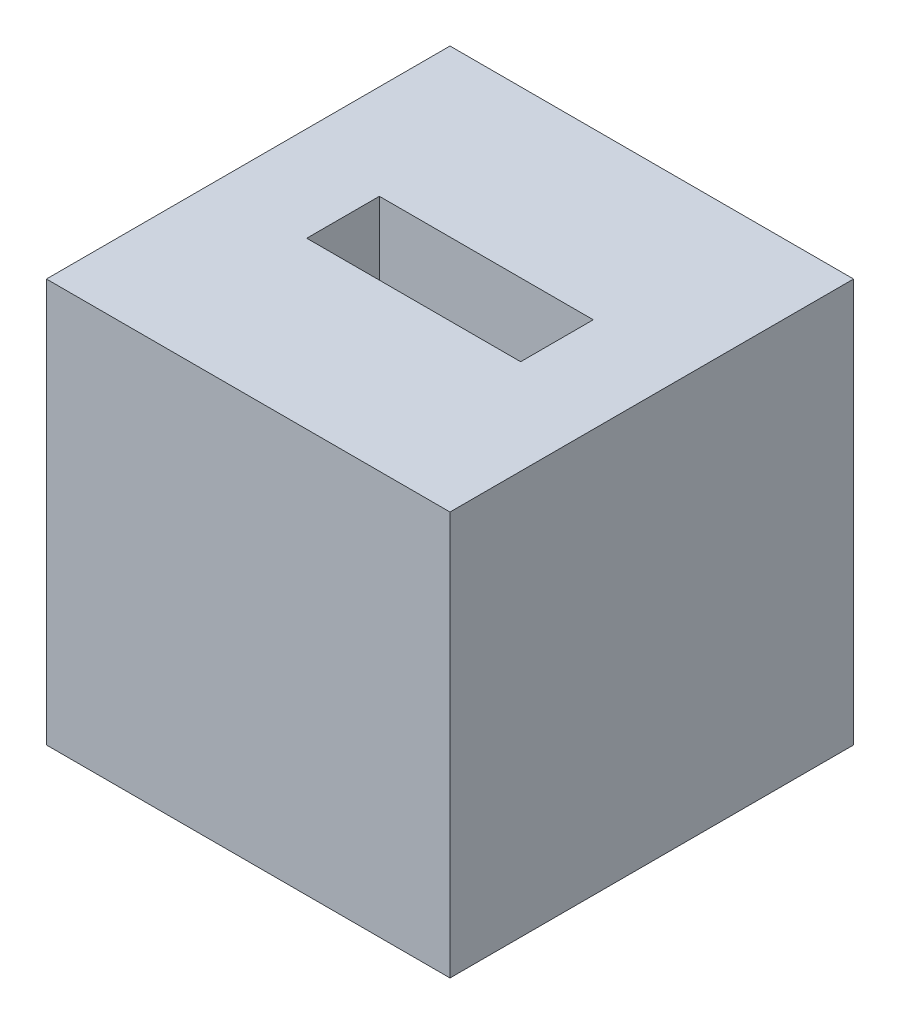
ISO-10303-21;
HEADER;
FILE_DESCRIPTION(('STEP AP214'),'2;1');
FILE_NAME('part.step','',(''),(''),'','','');
FILE_SCHEMA(('AUTOMOTIVE_DESIGN { 1 0 10303 214 1 1 1 1 }'));
ENDSEC;
DATA;
#1=APPLICATION_CONTEXT('core data for automotive mechanical design processes');
#2=APPLICATION_PROTOCOL_DEFINITION('international standard','automotive_design',2000,#1);
#3=PRODUCT_CONTEXT('',#1,'mechanical');
#4=PRODUCT('Part','Part','',(#3));
#5=PRODUCT_RELATED_PRODUCT_CATEGORY('part','',(#4));
#6=PRODUCT_DEFINITION_FORMATION('','',#4);
#7=PRODUCT_DEFINITION_CONTEXT('part definition',#1,'design');
#8=PRODUCT_DEFINITION('design','',#6,#7);
#9=PRODUCT_DEFINITION_SHAPE('','',#8);
#10=(LENGTH_UNIT() NAMED_UNIT(*) SI_UNIT(.MILLI.,.METRE.));
#11=(NAMED_UNIT(*) PLANE_ANGLE_UNIT() SI_UNIT($,.RADIAN.));
#12=(NAMED_UNIT(*) SI_UNIT($,.STERADIAN.) SOLID_ANGLE_UNIT());
#13=UNCERTAINTY_MEASURE_WITH_UNIT(LENGTH_MEASURE(1.E-05),#10,'distance_accuracy_value','');
#14=(GEOMETRIC_REPRESENTATION_CONTEXT(3) GLOBAL_UNCERTAINTY_ASSIGNED_CONTEXT((#13)) GLOBAL_UNIT_ASSIGNED_CONTEXT((#10,
#11,#12)) REPRESENTATION_CONTEXT('',''));
#15=CARTESIAN_POINT('',(0.,0.,0.));
#16=DIRECTION('',(0.,0.,1.));
#17=DIRECTION('',(1.,0.,0.));
#18=AXIS2_PLACEMENT_3D('',#15,#16,#17);
#19=CARTESIAN_POINT('',(5.,10.,-5.));
#20=DIRECTION('',(-1.,0.,0.));
#21=DIRECTION('',(0.,0.,1.));
#22=AXIS2_PLACEMENT_3D('',#19,#20,#21);
#23=PLANE('',#22);
#24=DIRECTION('',(0.,0.,-1.));
#25=VECTOR('',#24,1.);
#26=CARTESIAN_POINT('',(5.,0.,-5.));
#27=LINE('',#26,#25);
#28=CARTESIAN_POINT('',(5.,0.,5.));
#29=VERTEX_POINT('',#28);
#30=CARTESIAN_POINT('',(5.,0.,-5.));
#31=VERTEX_POINT('',#30);
#32=EDGE_CURVE('E147',#29,#31,#27,.T.);
#33=ORIENTED_EDGE('',*,*,#32,.T.);
#34=DIRECTION('',(0.,-1.,0.));
#35=VECTOR('',#34,1.);
#36=CARTESIAN_POINT('',(5.,10.,-5.));
#37=LINE('',#36,#35);
#38=CARTESIAN_POINT('',(5.,10.,-5.));
#39=VERTEX_POINT('',#38);
#40=EDGE_CURVE('E11',#39,#31,#37,.T.);
#41=ORIENTED_EDGE('',*,*,#40,.F.);
#42=DIRECTION('',(0.,0.,-1.));
#43=VECTOR('',#42,1.);
#44=CARTESIAN_POINT('',(5.,10.,-5.));
#45=LINE('',#44,#43);
#46=CARTESIAN_POINT('',(5.,10.,5.));
#47=VERTEX_POINT('',#46);
#48=EDGE_CURVE('E153',#47,#39,#45,.T.);
#49=ORIENTED_EDGE('',*,*,#48,.F.);
#50=DIRECTION('',(0.,-1.,0.));
#51=VECTOR('',#50,1.);
#52=CARTESIAN_POINT('',(5.,10.,5.));
#53=LINE('',#52,#51);
#54=EDGE_CURVE('E167',#47,#29,#53,.T.);
#55=ORIENTED_EDGE('',*,*,#54,.T.);
#56=EDGE_LOOP('',(#33,#41,#49,#55));
#57=FACE_BOUND('',#56,.T.);
#58=ADVANCED_FACE('F39',(#57),#23,.F.);
#59=CARTESIAN_POINT('',(-5.,10.,-5.));
#60=DIRECTION('',(0.,0.,1.));
#61=DIRECTION('',(1.,0.,0.));
#62=AXIS2_PLACEMENT_3D('',#59,#60,#61);
#63=PLANE('',#62);
#64=DIRECTION('',(-1.,0.,0.));
#65=VECTOR('',#64,1.);
#66=CARTESIAN_POINT('',(-5.,0.,-5.));
#67=LINE('',#66,#65);
#68=CARTESIAN_POINT('',(-5.,0.,-5.));
#69=VERTEX_POINT('',#68);
#70=EDGE_CURVE('E171',#31,#69,#67,.T.);
#71=ORIENTED_EDGE('',*,*,#70,.T.);
#72=DIRECTION('',(0.,-1.,0.));
#73=VECTOR('',#72,1.);
#74=CARTESIAN_POINT('',(-5.,10.,-5.));
#75=LINE('',#74,#73);
#76=CARTESIAN_POINT('',(-5.,10.,-5.));
#77=VERTEX_POINT('',#76);
#78=EDGE_CURVE('E47',#77,#69,#75,.T.);
#79=ORIENTED_EDGE('',*,*,#78,.F.);
#80=DIRECTION('',(-1.,0.,0.));
#81=VECTOR('',#80,1.);
#82=CARTESIAN_POINT('',(-5.,10.,-5.));
#83=LINE('',#82,#81);
#84=EDGE_CURVE('E157',#39,#77,#83,.T.);
#85=ORIENTED_EDGE('',*,*,#84,.F.);
#86=ORIENTED_EDGE('',*,*,#40,.T.);
#87=EDGE_LOOP('',(#71,#79,#85,#86));
#88=FACE_BOUND('',#87,.T.);
#89=ADVANCED_FACE('F205',(#88),#63,.F.);
#90=CARTESIAN_POINT('',(-5.,10.,-5.));
#91=DIRECTION('',(1.,0.,0.));
#92=DIRECTION('',(0.,0.,-1.));
#93=AXIS2_PLACEMENT_3D('',#90,#91,#92);
#94=PLANE('',#93);
#95=DIRECTION('',(0.,0.,1.));
#96=VECTOR('',#95,1.);
#97=CARTESIAN_POINT('',(-5.,0.,-5.));
#98=LINE('',#97,#96);
#99=CARTESIAN_POINT('',(-5.,0.,5.));
#100=VERTEX_POINT('',#99);
#101=EDGE_CURVE('E174',#69,#100,#98,.T.);
#102=ORIENTED_EDGE('',*,*,#101,.T.);
#103=DIRECTION('',(0.,-1.,0.));
#104=VECTOR('',#103,1.);
#105=CARTESIAN_POINT('',(-5.,10.,5.));
#106=LINE('',#105,#104);
#107=CARTESIAN_POINT('',(-5.,10.,5.));
#108=VERTEX_POINT('',#107);
#109=EDGE_CURVE('E182',#108,#100,#106,.T.);
#110=ORIENTED_EDGE('',*,*,#109,.F.);
#111=DIRECTION('',(0.,0.,1.));
#112=VECTOR('',#111,1.);
#113=CARTESIAN_POINT('',(-5.,10.,-5.));
#114=LINE('',#113,#112);
#115=EDGE_CURVE('E161',#77,#108,#114,.T.);
#116=ORIENTED_EDGE('',*,*,#115,.F.);
#117=ORIENTED_EDGE('',*,*,#78,.T.);
#118=EDGE_LOOP('',(#102,#110,#116,#117));
#119=FACE_BOUND('',#118,.T.);
#120=ADVANCED_FACE('F191',(#119),#94,.F.);
#121=CARTESIAN_POINT('',(-5.,10.,5.));
#122=DIRECTION('',(0.,0.,-1.));
#123=DIRECTION('',(-1.,0.,0.));
#124=AXIS2_PLACEMENT_3D('',#121,#122,#123);
#125=PLANE('',#124);
#126=DIRECTION('',(1.,0.,0.));
#127=VECTOR('',#126,1.);
#128=CARTESIAN_POINT('',(-5.,0.,5.));
#129=LINE('',#128,#127);
#130=EDGE_CURVE('E158',#100,#29,#129,.T.);
#131=ORIENTED_EDGE('',*,*,#130,.T.);
#132=ORIENTED_EDGE('',*,*,#54,.F.);
#133=DIRECTION('',(1.,0.,0.));
#134=VECTOR('',#133,1.);
#135=CARTESIAN_POINT('',(-5.,10.,5.));
#136=LINE('',#135,#134);
#137=EDGE_CURVE('E164',#108,#47,#136,.T.);
#138=ORIENTED_EDGE('',*,*,#137,.F.);
#139=ORIENTED_EDGE('',*,*,#109,.T.);
#140=EDGE_LOOP('',(#131,#132,#138,#139));
#141=FACE_BOUND('',#140,.T.);
#142=ADVANCED_FACE('F198',(#141),#125,.F.);
#143=CARTESIAN_POINT('',(0.,10.,0.));
#144=DIRECTION('',(0.,1.,0.));
#145=DIRECTION('',(0.,0.,1.));
#146=AXIS2_PLACEMENT_3D('',#143,#144,#145);
#147=PLANE('',#146);
#148=DIRECTION('',(0.,0.,-1.));
#149=VECTOR('',#148,1.);
#150=CARTESIAN_POINT('',(2.65,10.,-0.9));
#151=LINE('',#150,#149);
#152=CARTESIAN_POINT('',(2.65,10.,0.9));
#153=VERTEX_POINT('',#152);
#154=CARTESIAN_POINT('',(2.65,10.,-0.9));
#155=VERTEX_POINT('',#154);
#156=EDGE_CURVE('E54',#153,#155,#151,.T.);
#157=ORIENTED_EDGE('',*,*,#156,.F.);
#158=DIRECTION('',(1.,0.,0.));
#159=VECTOR('',#158,1.);
#160=CARTESIAN_POINT('',(-2.65,10.,0.9));
#161=LINE('',#160,#159);
#162=CARTESIAN_POINT('',(-2.65,10.,0.9));
#163=VERTEX_POINT('',#162);
#164=EDGE_CURVE('E125',#163,#153,#161,.T.);
#165=ORIENTED_EDGE('',*,*,#164,.F.);
#166=DIRECTION('',(0.,0.,1.));
#167=VECTOR('',#166,1.);
#168=CARTESIAN_POINT('',(-2.65,10.,-0.9));
#169=LINE('',#168,#167);
#170=CARTESIAN_POINT('',(-2.65,10.,-0.9));
#171=VERTEX_POINT('',#170);
#172=EDGE_CURVE('E129',#171,#163,#169,.T.);
#173=ORIENTED_EDGE('',*,*,#172,.F.);
#174=DIRECTION('',(-1.,0.,0.));
#175=VECTOR('',#174,1.);
#176=CARTESIAN_POINT('',(-2.65,10.,-0.9));
#177=LINE('',#176,#175);
#178=EDGE_CURVE('E138',#155,#171,#177,.T.);
#179=ORIENTED_EDGE('',*,*,#178,.F.);
#180=EDGE_LOOP('',(#157,#165,#173,#179));
#181=FACE_BOUND('',#180,.T.);
#182=ORIENTED_EDGE('',*,*,#48,.T.);
#183=ORIENTED_EDGE('',*,*,#84,.T.);
#184=ORIENTED_EDGE('',*,*,#115,.T.);
#185=ORIENTED_EDGE('',*,*,#137,.T.);
#186=EDGE_LOOP('',(#182,#183,#184,#185));
#187=FACE_BOUND('',#186,.T.);
#188=ADVANCED_FACE('F204',(#181,#187),#147,.T.);
#189=CARTESIAN_POINT('',(0.,0.,0.));
#190=DIRECTION('',(0.,1.,0.));
#191=DIRECTION('',(0.,0.,1.));
#192=AXIS2_PLACEMENT_3D('',#189,#190,#191);
#193=PLANE('',#192);
#194=DIRECTION('',(1.,0.,0.));
#195=VECTOR('',#194,1.);
#196=CARTESIAN_POINT('',(-2.65,0.,0.9));
#197=LINE('',#196,#195);
#198=CARTESIAN_POINT('',(-2.65,0.,0.9));
#199=VERTEX_POINT('',#198);
#200=CARTESIAN_POINT('',(2.65,0.,0.9));
#201=VERTEX_POINT('',#200);
#202=EDGE_CURVE('E113',#199,#201,#197,.T.);
#203=ORIENTED_EDGE('',*,*,#202,.T.);
#204=DIRECTION('',(0.,0.,-1.));
#205=VECTOR('',#204,1.);
#206=CARTESIAN_POINT('',(2.65,0.,-0.9));
#207=LINE('',#206,#205);
#208=CARTESIAN_POINT('',(2.65,0.,-0.9));
#209=VERTEX_POINT('',#208);
#210=EDGE_CURVE('E106',#201,#209,#207,.T.);
#211=ORIENTED_EDGE('',*,*,#210,.T.);
#212=DIRECTION('',(-1.,0.,0.));
#213=VECTOR('',#212,1.);
#214=CARTESIAN_POINT('',(-2.65,0.,-0.9));
#215=LINE('',#214,#213);
#216=CARTESIAN_POINT('',(-2.65,0.,-0.9));
#217=VERTEX_POINT('',#216);
#218=EDGE_CURVE('E116',#209,#217,#215,.T.);
#219=ORIENTED_EDGE('',*,*,#218,.T.);
#220=DIRECTION('',(0.,0.,1.));
#221=VECTOR('',#220,1.);
#222=CARTESIAN_POINT('',(-2.65,0.,-0.9));
#223=LINE('',#222,#221);
#224=EDGE_CURVE('E62',#217,#199,#223,.T.);
#225=ORIENTED_EDGE('',*,*,#224,.T.);
#226=EDGE_LOOP('',(#203,#211,#219,#225));
#227=FACE_BOUND('',#226,.T.);
#228=ORIENTED_EDGE('',*,*,#32,.F.);
#229=ORIENTED_EDGE('',*,*,#130,.F.);
#230=ORIENTED_EDGE('',*,*,#101,.F.);
#231=ORIENTED_EDGE('',*,*,#70,.F.);
#232=EDGE_LOOP('',(#228,#229,#230,#231));
#233=FACE_BOUND('',#232,.T.);
#234=ADVANCED_FACE('F121',(#227,#233),#193,.F.);
#235=CARTESIAN_POINT('',(2.65,0.,-0.9));
#236=DIRECTION('',(1.,0.,0.));
#237=DIRECTION('',(0.,0.,-1.));
#238=AXIS2_PLACEMENT_3D('',#235,#236,#237);
#239=PLANE('',#238);
#240=ORIENTED_EDGE('',*,*,#156,.T.);
#241=DIRECTION('',(0.,1.,0.));
#242=VECTOR('',#241,1.);
#243=CARTESIAN_POINT('',(2.65,0.,-0.9));
#244=LINE('',#243,#242);
#245=EDGE_CURVE('E102',#209,#155,#244,.T.);
#246=ORIENTED_EDGE('',*,*,#245,.F.);
#247=ORIENTED_EDGE('',*,*,#210,.F.);
#248=DIRECTION('',(0.,1.,0.));
#249=VECTOR('',#248,1.);
#250=CARTESIAN_POINT('',(2.65,0.,0.9));
#251=LINE('',#250,#249);
#252=EDGE_CURVE('E144',#201,#153,#251,.T.);
#253=ORIENTED_EDGE('',*,*,#252,.T.);
#254=EDGE_LOOP('',(#240,#246,#247,#253));
#255=FACE_BOUND('',#254,.T.);
#256=ADVANCED_FACE('F104',(#255),#239,.F.);
#257=CARTESIAN_POINT('',(-2.65,0.,0.9));
#258=DIRECTION('',(0.,0.,1.));
#259=DIRECTION('',(1.,0.,0.));
#260=AXIS2_PLACEMENT_3D('',#257,#258,#259);
#261=PLANE('',#260);
#262=ORIENTED_EDGE('',*,*,#164,.T.);
#263=ORIENTED_EDGE('',*,*,#252,.F.);
#264=ORIENTED_EDGE('',*,*,#202,.F.);
#265=DIRECTION('',(0.,1.,0.));
#266=VECTOR('',#265,1.);
#267=CARTESIAN_POINT('',(-2.65,0.,0.9));
#268=LINE('',#267,#266);
#269=EDGE_CURVE('E148',#199,#163,#268,.T.);
#270=ORIENTED_EDGE('',*,*,#269,.T.);
#271=EDGE_LOOP('',(#262,#263,#264,#270));
#272=FACE_BOUND('',#271,.T.);
#273=ADVANCED_FACE('F222',(#272),#261,.F.);
#274=CARTESIAN_POINT('',(-2.65,0.,-0.9));
#275=DIRECTION('',(-1.,0.,0.));
#276=DIRECTION('',(0.,0.,1.));
#277=AXIS2_PLACEMENT_3D('',#274,#275,#276);
#278=PLANE('',#277);
#279=ORIENTED_EDGE('',*,*,#172,.T.);
#280=ORIENTED_EDGE('',*,*,#269,.F.);
#281=ORIENTED_EDGE('',*,*,#224,.F.);
#282=DIRECTION('',(0.,1.,0.));
#283=VECTOR('',#282,1.);
#284=CARTESIAN_POINT('',(-2.65,0.,-0.9));
#285=LINE('',#284,#283);
#286=EDGE_CURVE('E112',#217,#171,#285,.T.);
#287=ORIENTED_EDGE('',*,*,#286,.T.);
#288=EDGE_LOOP('',(#279,#280,#281,#287));
#289=FACE_BOUND('',#288,.T.);
#290=ADVANCED_FACE('F225',(#289),#278,.F.);
#291=CARTESIAN_POINT('',(-2.65,0.,-0.9));
#292=DIRECTION('',(0.,0.,-1.));
#293=DIRECTION('',(-1.,0.,0.));
#294=AXIS2_PLACEMENT_3D('',#291,#292,#293);
#295=PLANE('',#294);
#296=ORIENTED_EDGE('',*,*,#178,.T.);
#297=ORIENTED_EDGE('',*,*,#286,.F.);
#298=ORIENTED_EDGE('',*,*,#218,.F.);
#299=ORIENTED_EDGE('',*,*,#245,.T.);
#300=EDGE_LOOP('',(#296,#297,#298,#299));
#301=FACE_BOUND('',#300,.T.);
#302=ADVANCED_FACE('F117',(#301),#295,.F.);
#303=CLOSED_SHELL('',(#58,#89,#120,#142,#188,#234,#256,#273,#290,#302));
#304=MANIFOLD_SOLID_BREP('B2',#303);
#305=ADVANCED_BREP_SHAPE_REPRESENTATION('',(#18,#304),#14);
#306=SHAPE_DEFINITION_REPRESENTATION(#9,#305);
ENDSEC;
END-ISO-10303-21;
